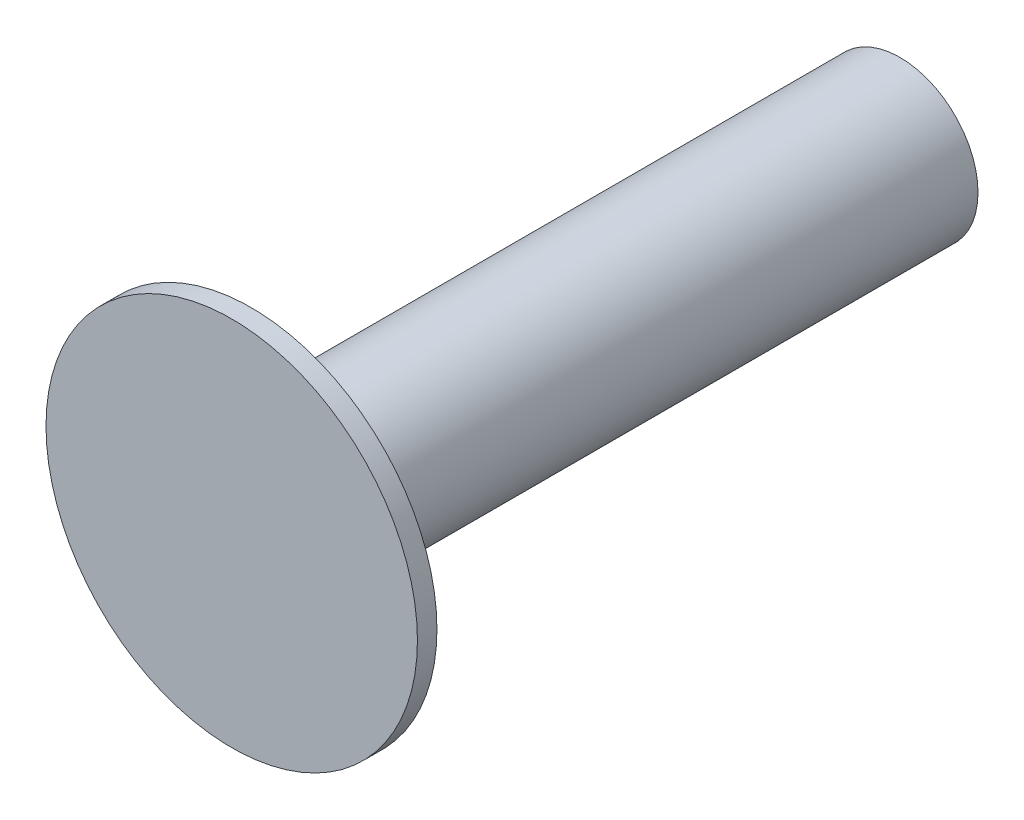
ISO-10303-21;
HEADER;
FILE_DESCRIPTION(('STEP AP214'),'2;1');
FILE_NAME('part.step','',(''),(''),'','','');
FILE_SCHEMA(('AUTOMOTIVE_DESIGN { 1 0 10303 214 1 1 1 1 }'));
ENDSEC;
DATA;
#1=APPLICATION_CONTEXT('core data for automotive mechanical design processes');
#2=APPLICATION_PROTOCOL_DEFINITION('international standard','automotive_design',2000,#1);
#3=PRODUCT_CONTEXT('',#1,'mechanical');
#4=PRODUCT('Part','Part','',(#3));
#5=PRODUCT_RELATED_PRODUCT_CATEGORY('part','',(#4));
#6=PRODUCT_DEFINITION_FORMATION('','',#4);
#7=PRODUCT_DEFINITION_CONTEXT('part definition',#1,'design');
#8=PRODUCT_DEFINITION('design','',#6,#7);
#9=PRODUCT_DEFINITION_SHAPE('','',#8);
#10=(LENGTH_UNIT() NAMED_UNIT(*) SI_UNIT(.MILLI.,.METRE.));
#11=(NAMED_UNIT(*) PLANE_ANGLE_UNIT() SI_UNIT($,.RADIAN.));
#12=(NAMED_UNIT(*) SI_UNIT($,.STERADIAN.) SOLID_ANGLE_UNIT());
#13=UNCERTAINTY_MEASURE_WITH_UNIT(LENGTH_MEASURE(1.E-05),#10,'distance_accuracy_value','');
#14=(GEOMETRIC_REPRESENTATION_CONTEXT(3) GLOBAL_UNCERTAINTY_ASSIGNED_CONTEXT((#13)) GLOBAL_UNIT_ASSIGNED_CONTEXT((#10,
#11,#12)) REPRESENTATION_CONTEXT('',''));
#15=CARTESIAN_POINT('',(0.,0.,0.));
#16=DIRECTION('',(0.,0.,1.));
#17=DIRECTION('',(1.,0.,0.));
#18=AXIS2_PLACEMENT_3D('',#15,#16,#17);
#19=CARTESIAN_POINT('',(0.,0.,33.274));
#20=DIRECTION('',(0.,0.,-1.));
#21=DIRECTION('',(-1.,0.,0.));
#22=AXIS2_PLACEMENT_3D('',#19,#20,#21);
#23=CYLINDRICAL_SURFACE('',#22,4.);
#24=CARTESIAN_POINT('',(0.,0.,33.274));
#25=DIRECTION('',(0.,0.,1.));
#26=DIRECTION('',(1.,0.,0.));
#27=AXIS2_PLACEMENT_3D('',#24,#25,#26);
#28=CIRCLE('',#27,4.);
#29=CARTESIAN_POINT('',(4.,0.,33.274));
#30=VERTEX_POINT('',#29);
#31=EDGE_CURVE('E11',#30,#30,#28,.T.);
#32=ORIENTED_EDGE('',*,*,#31,.F.);
#33=EDGE_LOOP('',(#32));
#34=FACE_BOUND('',#33,.T.);
#35=CARTESIAN_POINT('',(0.,0.,0.));
#36=DIRECTION('',(0.,0.,1.));
#37=DIRECTION('',(1.,0.,0.));
#38=AXIS2_PLACEMENT_3D('',#35,#36,#37);
#39=CIRCLE('',#38,4.);
#40=CARTESIAN_POINT('',(4.,0.,0.));
#41=VERTEX_POINT('',#40);
#42=EDGE_CURVE('E44',#41,#41,#39,.T.);
#43=ORIENTED_EDGE('',*,*,#42,.T.);
#44=EDGE_LOOP('',(#43));
#45=FACE_BOUND('',#44,.T.);
#46=ADVANCED_FACE('F41',(#34,#45),#23,.T.);
#47=CARTESIAN_POINT('',(0.,0.,0.));
#48=DIRECTION('',(0.,0.,1.));
#49=DIRECTION('',(1.,0.,0.));
#50=AXIS2_PLACEMENT_3D('',#47,#48,#49);
#51=PLANE('',#50);
#52=CARTESIAN_POINT('',(0.,0.,0.));
#53=DIRECTION('',(0.,0.,-1.));
#54=DIRECTION('',(-1.,0.,0.));
#55=AXIS2_PLACEMENT_3D('',#52,#53,#54);
#56=CIRCLE('',#55,2.);
#57=CARTESIAN_POINT('',(-2.,0.,0.));
#58=VERTEX_POINT('',#57);
#59=EDGE_CURVE('E61',#58,#58,#56,.T.);
#60=ORIENTED_EDGE('',*,*,#59,.F.);
#61=EDGE_LOOP('',(#60));
#62=FACE_BOUND('',#61,.T.);
#63=ORIENTED_EDGE('',*,*,#42,.F.);
#64=EDGE_LOOP('',(#63));
#65=FACE_BOUND('',#64,.T.);
#66=ADVANCED_FACE('F68',(#62,#65),#51,.F.);
#67=CARTESIAN_POINT('',(0.,0.,34.274));
#68=DIRECTION('',(0.,0.,-1.));
#69=DIRECTION('',(-1.,0.,0.));
#70=AXIS2_PLACEMENT_3D('',#67,#68,#69);
#71=CYLINDRICAL_SURFACE('',#70,9.525);
#72=CARTESIAN_POINT('',(0.,0.,34.274));
#73=DIRECTION('',(0.,0.,1.));
#74=DIRECTION('',(1.,0.,0.));
#75=AXIS2_PLACEMENT_3D('',#72,#73,#74);
#76=CIRCLE('',#75,9.525);
#77=CARTESIAN_POINT('',(9.525,0.,34.274));
#78=VERTEX_POINT('',#77);
#79=EDGE_CURVE('E51',#78,#78,#76,.T.);
#80=ORIENTED_EDGE('',*,*,#79,.F.);
#81=EDGE_LOOP('',(#80));
#82=FACE_BOUND('',#81,.T.);
#83=CARTESIAN_POINT('',(0.,0.,33.274));
#84=DIRECTION('',(0.,0.,1.));
#85=DIRECTION('',(1.,0.,0.));
#86=AXIS2_PLACEMENT_3D('',#83,#84,#85);
#87=CIRCLE('',#86,9.525);
#88=CARTESIAN_POINT('',(9.525,0.,33.274));
#89=VERTEX_POINT('',#88);
#90=EDGE_CURVE('E53',#89,#89,#87,.T.);
#91=ORIENTED_EDGE('',*,*,#90,.T.);
#92=EDGE_LOOP('',(#91));
#93=FACE_BOUND('',#92,.T.);
#94=ADVANCED_FACE('F71',(#82,#93),#71,.T.);
#95=CARTESIAN_POINT('',(0.,0.,34.274));
#96=DIRECTION('',(0.,0.,1.));
#97=DIRECTION('',(1.,0.,0.));
#98=AXIS2_PLACEMENT_3D('',#95,#96,#97);
#99=PLANE('',#98);
#100=ORIENTED_EDGE('',*,*,#79,.T.);
#101=EDGE_LOOP('',(#100));
#102=FACE_BOUND('',#101,.T.);
#103=ADVANCED_FACE('F86',(#102),#99,.T.);
#104=CARTESIAN_POINT('',(0.,0.,33.274));
#105=DIRECTION('',(0.,0.,1.));
#106=DIRECTION('',(1.,0.,0.));
#107=AXIS2_PLACEMENT_3D('',#104,#105,#106);
#108=PLANE('',#107);
#109=ORIENTED_EDGE('',*,*,#31,.T.);
#110=EDGE_LOOP('',(#109));
#111=FACE_BOUND('',#110,.T.);
#112=ORIENTED_EDGE('',*,*,#90,.F.);
#113=EDGE_LOOP('',(#112));
#114=FACE_BOUND('',#113,.T.);
#115=ADVANCED_FACE('F95',(#111,#114),#108,.F.);
#116=CARTESIAN_POINT('',(0.,0.,15.));
#117=DIRECTION('',(0.,0.,1.));
#118=DIRECTION('',(1.,0.,0.));
#119=AXIS2_PLACEMENT_3D('',#116,#117,#118);
#120=PLANE('',#119);
#121=CARTESIAN_POINT('',(0.,0.,15.));
#122=DIRECTION('',(0.,0.,1.));
#123=DIRECTION('',(1.,0.,0.));
#124=AXIS2_PLACEMENT_3D('',#121,#122,#123);
#125=CIRCLE('',#124,2.);
#126=CARTESIAN_POINT('',(2.,0.,15.));
#127=VERTEX_POINT('',#126);
#128=EDGE_CURVE('E56',#127,#127,#125,.F.);
#129=ORIENTED_EDGE('',*,*,#128,.T.);
#130=EDGE_LOOP('',(#129));
#131=FACE_BOUND('',#130,.T.);
#132=ADVANCED_FACE('F103',(#131),#120,.F.);
#133=CARTESIAN_POINT('',(0.,0.,35.6568542494924));
#134=DIRECTION('',(0.,0.,-1.));
#135=DIRECTION('',(-1.,0.,0.));
#136=AXIS2_PLACEMENT_3D('',#133,#134,#135);
#137=CYLINDRICAL_SURFACE('',#136,2.);
#138=ORIENTED_EDGE('',*,*,#59,.T.);
#139=EDGE_LOOP('',(#138));
#140=FACE_BOUND('',#139,.T.);
#141=ORIENTED_EDGE('',*,*,#128,.F.);
#142=EDGE_LOOP('',(#141));
#143=FACE_BOUND('',#142,.T.);
#144=ADVANCED_FACE('F65',(#140,#143),#137,.F.);
#145=CLOSED_SHELL('',(#46,#66,#94,#103,#115,#132,#144));
#146=MANIFOLD_SOLID_BREP('B2',#145);
#147=ADVANCED_BREP_SHAPE_REPRESENTATION('',(#18,#146),#14);
#148=SHAPE_DEFINITION_REPRESENTATION(#9,#147);
ENDSEC;
END-ISO-10303-21;
